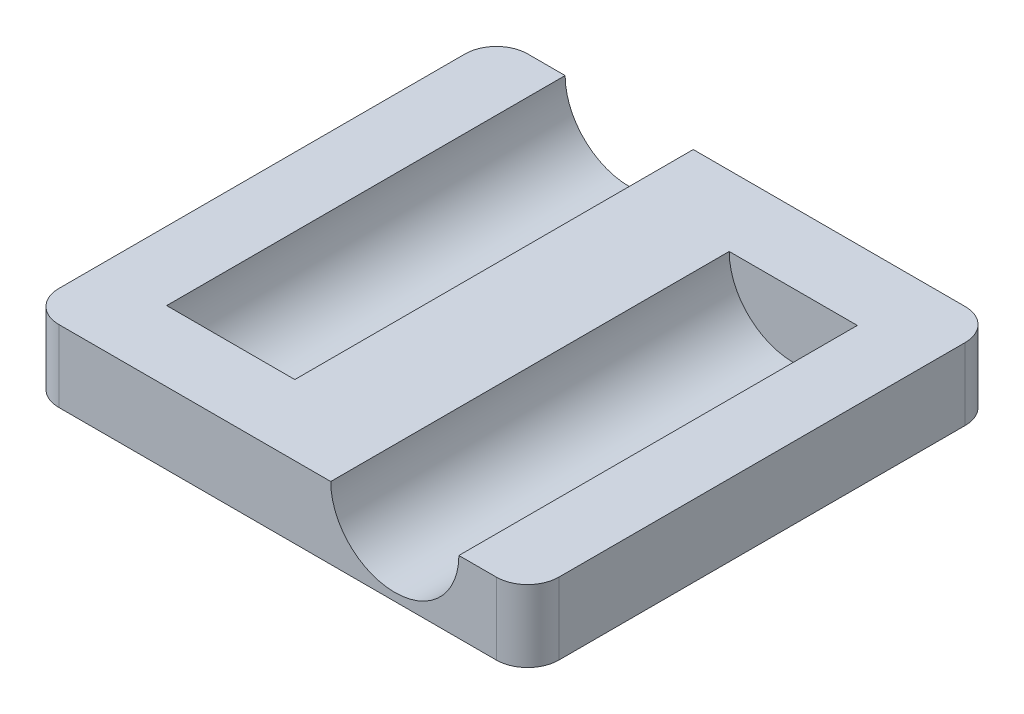
ISO-10303-21;
HEADER;
FILE_DESCRIPTION(('STEP AP214'),'2;1');
FILE_NAME('part.step','',(''),(''),'','','');
FILE_SCHEMA(('AUTOMOTIVE_DESIGN { 1 0 10303 214 1 1 1 1 }'));
ENDSEC;
DATA;
#1=APPLICATION_CONTEXT('core data for automotive mechanical design processes');
#2=APPLICATION_PROTOCOL_DEFINITION('international standard','automotive_design',2000,#1);
#3=PRODUCT_CONTEXT('',#1,'mechanical');
#4=PRODUCT('Part','Part','',(#3));
#5=PRODUCT_RELATED_PRODUCT_CATEGORY('part','',(#4));
#6=PRODUCT_DEFINITION_FORMATION('','',#4);
#7=PRODUCT_DEFINITION_CONTEXT('part definition',#1,'design');
#8=PRODUCT_DEFINITION('design','',#6,#7);
#9=PRODUCT_DEFINITION_SHAPE('','',#8);
#10=(LENGTH_UNIT() NAMED_UNIT(*) SI_UNIT(.MILLI.,.METRE.));
#11=(NAMED_UNIT(*) PLANE_ANGLE_UNIT() SI_UNIT($,.RADIAN.));
#12=(NAMED_UNIT(*) SI_UNIT($,.STERADIAN.) SOLID_ANGLE_UNIT());
#13=UNCERTAINTY_MEASURE_WITH_UNIT(LENGTH_MEASURE(1.E-05),#10,'distance_accuracy_value','');
#14=(GEOMETRIC_REPRESENTATION_CONTEXT(3) GLOBAL_UNCERTAINTY_ASSIGNED_CONTEXT((#13)) GLOBAL_UNIT_ASSIGNED_CONTEXT((#10,
#11,#12)) REPRESENTATION_CONTEXT('',''));
#15=CARTESIAN_POINT('',(0.,0.,0.));
#16=DIRECTION('',(0.,0.,1.));
#17=DIRECTION('',(1.,0.,0.));
#18=AXIS2_PLACEMENT_3D('',#15,#16,#17);
#19=CARTESIAN_POINT('',(-12.0456842552275,-6.59784370077646,30.));
#20=DIRECTION('',(1.,0.,0.));
#21=DIRECTION('',(0.,0.,-1.));
#22=AXIS2_PLACEMENT_3D('',#19,#20,#21);
#23=PLANE('',#22);
#24=DIRECTION('',(0.,-1.,0.));
#25=VECTOR('',#24,1.);
#26=CARTESIAN_POINT('',(-12.0456842552275,-6.59784370077646,2.));
#27=LINE('',#26,#25);
#28=CARTESIAN_POINT('',(-12.0456842552275,-0.197843700776463,2.));
#29=VERTEX_POINT('',#28);
#30=CARTESIAN_POINT('',(-12.0456842552275,-4.79784370077647,2.));
#31=VERTEX_POINT('',#30);
#32=EDGE_CURVE('E188',#29,#31,#27,.T.);
#33=ORIENTED_EDGE('',*,*,#32,.T.);
#34=DIRECTION('',(0.,0.,1.));
#35=VECTOR('',#34,1.);
#36=CARTESIAN_POINT('',(-12.0456842552275,-4.79784370077647,0.));
#37=LINE('',#36,#35);
#38=CARTESIAN_POINT('',(-12.0456842552275,-4.79784370077647,28.));
#39=VERTEX_POINT('',#38);
#40=EDGE_CURVE('E122',#31,#39,#37,.T.);
#41=ORIENTED_EDGE('',*,*,#40,.T.);
#42=DIRECTION('',(0.,-1.,0.));
#43=VECTOR('',#42,1.);
#44=CARTESIAN_POINT('',(-12.0456842552275,-6.59784370077646,28.));
#45=LINE('',#44,#43);
#46=CARTESIAN_POINT('',(-12.0456842552275,-0.197843700776462,28.));
#47=VERTEX_POINT('',#46);
#48=EDGE_CURVE('E149',#39,#47,#45,.F.);
#49=ORIENTED_EDGE('',*,*,#48,.T.);
#50=DIRECTION('',(0.,0.,1.));
#51=VECTOR('',#50,1.);
#52=CARTESIAN_POINT('',(-12.0456842552275,-0.197843700776462,0.));
#53=LINE('',#52,#51);
#54=EDGE_CURVE('E193',#29,#47,#53,.T.);
#55=ORIENTED_EDGE('',*,*,#54,.F.);
#56=EDGE_LOOP('',(#33,#41,#49,#55));
#57=FACE_BOUND('',#56,.T.);
#58=ADVANCED_FACE('F33',(#57),#23,.F.);
#59=CARTESIAN_POINT('',(19.9543157447725,-6.59784370077646,30.));
#60=DIRECTION('',(-1.,0.,0.));
#61=DIRECTION('',(0.,0.,1.));
#62=AXIS2_PLACEMENT_3D('',#59,#60,#61);
#63=PLANE('',#62);
#64=DIRECTION('',(0.,1.,0.));
#65=VECTOR('',#64,1.);
#66=CARTESIAN_POINT('',(19.9543157447725,-6.59784370077646,28.));
#67=LINE('',#66,#65);
#68=CARTESIAN_POINT('',(19.9543157447725,-0.197843700776462,28.));
#69=VERTEX_POINT('',#68);
#70=CARTESIAN_POINT('',(19.9543157447725,-4.79784370077646,28.));
#71=VERTEX_POINT('',#70);
#72=EDGE_CURVE('E185',#69,#71,#67,.F.);
#73=ORIENTED_EDGE('',*,*,#72,.T.);
#74=DIRECTION('',(0.,0.,1.));
#75=VECTOR('',#74,1.);
#76=CARTESIAN_POINT('',(19.9543157447725,-4.79784370077646,0.));
#77=LINE('',#76,#75);
#78=CARTESIAN_POINT('',(19.9543157447725,-4.79784370077646,2.));
#79=VERTEX_POINT('',#78);
#80=EDGE_CURVE('E138',#79,#71,#77,.T.);
#81=ORIENTED_EDGE('',*,*,#80,.F.);
#82=DIRECTION('',(0.,1.,0.));
#83=VECTOR('',#82,1.);
#84=CARTESIAN_POINT('',(19.9543157447725,-0.0978437007764623,2.));
#85=LINE('',#84,#83);
#86=CARTESIAN_POINT('',(19.9543157447725,-0.197843700776463,2.));
#87=VERTEX_POINT('',#86);
#88=EDGE_CURVE('E183',#79,#87,#85,.T.);
#89=ORIENTED_EDGE('',*,*,#88,.T.);
#90=DIRECTION('',(0.,0.,1.));
#91=VECTOR('',#90,1.);
#92=CARTESIAN_POINT('',(19.9543157447725,-0.197843700776462,0.));
#93=LINE('',#92,#91);
#94=EDGE_CURVE('E198',#87,#69,#93,.T.);
#95=ORIENTED_EDGE('',*,*,#94,.T.);
#96=EDGE_LOOP('',(#73,#81,#89,#95));
#97=FACE_BOUND('',#96,.T.);
#98=ADVANCED_FACE('F239',(#97),#63,.F.);
#99=CARTESIAN_POINT('',(0.,0.,30.));
#100=DIRECTION('',(0.,0.,-1.));
#101=DIRECTION('',(-1.,0.,0.));
#102=AXIS2_PLACEMENT_3D('',#99,#100,#101);
#103=PLANE('',#102);
#104=DIRECTION('',(0.,-1.,0.));
#105=VECTOR('',#104,1.);
#106=CARTESIAN_POINT('',(-10.0456842552275,0.,30.));
#107=LINE('',#106,#105);
#108=CARTESIAN_POINT('',(-10.0456842552275,-0.197843700776462,30.));
#109=VERTEX_POINT('',#108);
#110=CARTESIAN_POINT('',(-10.0456842552275,-4.79784370077647,30.));
#111=VERTEX_POINT('',#110);
#112=EDGE_CURVE('E173',#109,#111,#107,.T.);
#113=ORIENTED_EDGE('',*,*,#112,.T.);
#114=DIRECTION('',(-1.,0.,0.));
#115=VECTOR('',#114,1.);
#116=CARTESIAN_POINT('',(19.9543157447725,-4.79784370077646,30.));
#117=LINE('',#116,#115);
#118=CARTESIAN_POINT('',(17.9543157447725,-4.79784370077646,30.));
#119=VERTEX_POINT('',#118);
#120=EDGE_CURVE('E139',#119,#111,#117,.T.);
#121=ORIENTED_EDGE('',*,*,#120,.F.);
#122=DIRECTION('',(0.,1.,0.));
#123=VECTOR('',#122,1.);
#124=CARTESIAN_POINT('',(17.9543157447725,0.,30.));
#125=LINE('',#124,#123);
#126=CARTESIAN_POINT('',(17.9543157447725,-0.197843700776462,30.));
#127=VERTEX_POINT('',#126);
#128=EDGE_CURVE('E181',#119,#127,#125,.T.);
#129=ORIENTED_EDGE('',*,*,#128,.T.);
#130=DIRECTION('',(1.,0.,0.));
#131=VECTOR('',#130,1.);
#132=CARTESIAN_POINT('',(-12.0456842552275,-0.197843700776462,30.));
#133=LINE('',#132,#131);
#134=CARTESIAN_POINT('',(15.5543157447725,-0.197843700776462,30.));
#135=VERTEX_POINT('',#134);
#136=EDGE_CURVE('E218',#135,#127,#133,.T.);
#137=ORIENTED_EDGE('',*,*,#136,.F.);
#138=CARTESIAN_POINT('',(11.4543157447725,-0.197843700776464,30.));
#139=DIRECTION('',(0.,0.,-1.));
#140=DIRECTION('',(-1.,0.,0.));
#141=AXIS2_PLACEMENT_3D('',#138,#139,#140);
#142=CIRCLE('',#141,4.1);
#143=CARTESIAN_POINT('',(7.35431574477247,-0.197843700776462,30.));
#144=VERTEX_POINT('',#143);
#145=EDGE_CURVE('E147',#135,#144,#142,.T.);
#146=ORIENTED_EDGE('',*,*,#145,.T.);
#147=EDGE_CURVE('E55',#109,#144,#133,.T.);
#148=ORIENTED_EDGE('',*,*,#147,.F.);
#149=EDGE_LOOP('',(#113,#121,#129,#137,#146,#148));
#150=FACE_BOUND('',#149,.T.);
#151=ADVANCED_FACE('F231',(#150),#103,.F.);
#152=CARTESIAN_POINT('',(0.,0.,0.));
#153=DIRECTION('',(0.,0.,-1.));
#154=DIRECTION('',(-1.,0.,0.));
#155=AXIS2_PLACEMENT_3D('',#152,#153,#154);
#156=PLANE('',#155);
#157=DIRECTION('',(-1.,0.,0.));
#158=VECTOR('',#157,1.);
#159=CARTESIAN_POINT('',(19.9543157447725,-4.79784370077646,0.));
#160=LINE('',#159,#158);
#161=CARTESIAN_POINT('',(17.9543157447725,-4.79784370077646,0.));
#162=VERTEX_POINT('',#161);
#163=CARTESIAN_POINT('',(-10.0456842552275,-4.79784370077647,0.));
#164=VERTEX_POINT('',#163);
#165=EDGE_CURVE('E47',#162,#164,#160,.T.);
#166=ORIENTED_EDGE('',*,*,#165,.T.);
#167=DIRECTION('',(0.,-1.,0.));
#168=VECTOR('',#167,1.);
#169=CARTESIAN_POINT('',(-10.0456842552275,-0.0978437007764623,0.));
#170=LINE('',#169,#168);
#171=CARTESIAN_POINT('',(-10.0456842552275,-0.197843700776462,0.));
#172=VERTEX_POINT('',#171);
#173=EDGE_CURVE('E133',#164,#172,#170,.F.);
#174=ORIENTED_EDGE('',*,*,#173,.T.);
#175=DIRECTION('',(1.,0.,0.));
#176=VECTOR('',#175,1.);
#177=CARTESIAN_POINT('',(-12.0456842552275,-0.197843700776462,0.));
#178=LINE('',#177,#176);
#179=CARTESIAN_POINT('',(-7.64568425522754,-0.197843700776462,0.));
#180=VERTEX_POINT('',#179);
#181=EDGE_CURVE('E199',#172,#180,#178,.T.);
#182=ORIENTED_EDGE('',*,*,#181,.T.);
#183=CARTESIAN_POINT('',(-3.54568425522754,-0.197843700776464,0.));
#184=DIRECTION('',(0.,0.,-1.));
#185=DIRECTION('',(-1.,0.,0.));
#186=AXIS2_PLACEMENT_3D('',#183,#184,#185);
#187=CIRCLE('',#186,4.1);
#188=CARTESIAN_POINT('',(0.554315744772464,-0.197843700776462,0.));
#189=VERTEX_POINT('',#188);
#190=EDGE_CURVE('E144',#189,#180,#187,.T.);
#191=ORIENTED_EDGE('',*,*,#190,.F.);
#192=CARTESIAN_POINT('',(17.9543157447725,-0.197843700776462,0.));
#193=VERTEX_POINT('',#192);
#194=EDGE_CURVE('E221',#189,#193,#178,.T.);
#195=ORIENTED_EDGE('',*,*,#194,.T.);
#196=DIRECTION('',(0.,1.,0.));
#197=VECTOR('',#196,1.);
#198=CARTESIAN_POINT('',(17.9543157447725,-6.59784370077646,0.));
#199=LINE('',#198,#197);
#200=EDGE_CURVE('E137',#193,#162,#199,.F.);
#201=ORIENTED_EDGE('',*,*,#200,.T.);
#202=EDGE_LOOP('',(#166,#174,#182,#191,#195,#201));
#203=FACE_BOUND('',#202,.T.);
#204=ADVANCED_FACE('F131',(#203),#156,.T.);
#205=CARTESIAN_POINT('',(17.9543157447725,0.,28.));
#206=DIRECTION('',(0.,1.,0.));
#207=DIRECTION('',(0.,0.,1.));
#208=AXIS2_PLACEMENT_3D('',#205,#206,#207);
#209=CYLINDRICAL_SURFACE('',#208,2.);
#210=CARTESIAN_POINT('',(17.9543157447725,-4.79784370077646,28.));
#211=DIRECTION('',(0.,1.,0.));
#212=DIRECTION('',(-1.,0.,0.));
#213=AXIS2_PLACEMENT_3D('',#210,#211,#212);
#214=CIRCLE('',#213,2.);
#215=EDGE_CURVE('E220',#71,#119,#214,.F.);
#216=ORIENTED_EDGE('',*,*,#215,.F.);
#217=ORIENTED_EDGE('',*,*,#72,.F.);
#218=CARTESIAN_POINT('',(17.9543157447725,-0.197843700776462,28.));
#219=DIRECTION('',(0.,-1.,0.));
#220=DIRECTION('',(0.,0.,-1.));
#221=AXIS2_PLACEMENT_3D('',#218,#219,#220);
#222=CIRCLE('',#221,2.);
#223=EDGE_CURVE('E170',#127,#69,#222,.F.);
#224=ORIENTED_EDGE('',*,*,#223,.F.);
#225=ORIENTED_EDGE('',*,*,#128,.F.);
#226=EDGE_LOOP('',(#216,#217,#224,#225));
#227=FACE_BOUND('',#226,.T.);
#228=ADVANCED_FACE('F236',(#227),#209,.T.);
#229=CARTESIAN_POINT('',(-10.0456842552275,0.,28.));
#230=DIRECTION('',(0.,-1.,0.));
#231=DIRECTION('',(0.,0.,-1.));
#232=AXIS2_PLACEMENT_3D('',#229,#230,#231);
#233=CYLINDRICAL_SURFACE('',#232,2.);
#234=CARTESIAN_POINT('',(-10.0456842552275,-4.79784370077647,28.));
#235=DIRECTION('',(0.,1.,0.));
#236=DIRECTION('',(-1.,0.,0.));
#237=AXIS2_PLACEMENT_3D('',#234,#235,#236);
#238=CIRCLE('',#237,2.);
#239=EDGE_CURVE('E127',#111,#39,#238,.F.);
#240=ORIENTED_EDGE('',*,*,#239,.F.);
#241=ORIENTED_EDGE('',*,*,#112,.F.);
#242=CARTESIAN_POINT('',(-10.0456842552275,-0.197843700776462,28.));
#243=DIRECTION('',(0.,-1.,0.));
#244=DIRECTION('',(0.,0.,-1.));
#245=AXIS2_PLACEMENT_3D('',#242,#243,#244);
#246=CIRCLE('',#245,2.);
#247=EDGE_CURVE('E175',#47,#109,#246,.F.);
#248=ORIENTED_EDGE('',*,*,#247,.F.);
#249=ORIENTED_EDGE('',*,*,#48,.F.);
#250=EDGE_LOOP('',(#240,#241,#248,#249));
#251=FACE_BOUND('',#250,.T.);
#252=ADVANCED_FACE('F202',(#251),#233,.T.);
#253=CARTESIAN_POINT('',(-10.0456842552275,-6.59784370077646,2.));
#254=DIRECTION('',(0.,1.,0.));
#255=DIRECTION('',(0.,0.,1.));
#256=AXIS2_PLACEMENT_3D('',#253,#254,#255);
#257=CYLINDRICAL_SURFACE('',#256,2.);
#258=CARTESIAN_POINT('',(-10.0456842552275,-4.79784370077647,2.));
#259=DIRECTION('',(0.,1.,0.));
#260=DIRECTION('',(-1.,0.,0.));
#261=AXIS2_PLACEMENT_3D('',#258,#259,#260);
#262=CIRCLE('',#261,2.);
#263=EDGE_CURVE('E119',#31,#164,#262,.F.);
#264=ORIENTED_EDGE('',*,*,#263,.F.);
#265=ORIENTED_EDGE('',*,*,#32,.F.);
#266=CARTESIAN_POINT('',(-10.0456842552275,-0.197843700776463,2.));
#267=DIRECTION('',(0.,-1.,0.));
#268=DIRECTION('',(0.,0.,-1.));
#269=AXIS2_PLACEMENT_3D('',#266,#267,#268);
#270=CIRCLE('',#269,2.);
#271=EDGE_CURVE('E143',#172,#29,#270,.F.);
#272=ORIENTED_EDGE('',*,*,#271,.F.);
#273=ORIENTED_EDGE('',*,*,#173,.F.);
#274=EDGE_LOOP('',(#264,#265,#272,#273));
#275=FACE_BOUND('',#274,.T.);
#276=ADVANCED_FACE('F142',(#275),#257,.T.);
#277=CARTESIAN_POINT('',(17.9543157447725,-6.59784370077646,2.));
#278=DIRECTION('',(0.,-1.,0.));
#279=DIRECTION('',(0.,0.,-1.));
#280=AXIS2_PLACEMENT_3D('',#277,#278,#279);
#281=CYLINDRICAL_SURFACE('',#280,2.);
#282=CARTESIAN_POINT('',(17.9543157447725,-4.79784370077646,2.));
#283=DIRECTION('',(0.,1.,0.));
#284=DIRECTION('',(-1.,0.,0.));
#285=AXIS2_PLACEMENT_3D('',#282,#283,#284);
#286=CIRCLE('',#285,2.);
#287=EDGE_CURVE('E11',#162,#79,#286,.F.);
#288=ORIENTED_EDGE('',*,*,#287,.F.);
#289=ORIENTED_EDGE('',*,*,#200,.F.);
#290=CARTESIAN_POINT('',(17.9543157447725,-0.197843700776463,2.));
#291=DIRECTION('',(0.,-1.,0.));
#292=DIRECTION('',(0.,0.,-1.));
#293=AXIS2_PLACEMENT_3D('',#290,#291,#292);
#294=CIRCLE('',#293,2.);
#295=EDGE_CURVE('E203',#87,#193,#294,.F.);
#296=ORIENTED_EDGE('',*,*,#295,.F.);
#297=ORIENTED_EDGE('',*,*,#88,.F.);
#298=EDGE_LOOP('',(#288,#289,#296,#297));
#299=FACE_BOUND('',#298,.T.);
#300=ADVANCED_FACE('F35',(#299),#281,.T.);
#301=CARTESIAN_POINT('',(-3.54568425522754,-0.197843700776464,25.5));
#302=DIRECTION('',(0.,0.,-1.));
#303=DIRECTION('',(-1.,0.,0.));
#304=AXIS2_PLACEMENT_3D('',#301,#302,#303);
#305=PLANE('',#304);
#306=DIRECTION('',(-1.,0.,0.));
#307=VECTOR('',#306,1.);
#308=CARTESIAN_POINT('',(-3.54568425522754,-0.197843700776464,25.5));
#309=LINE('',#308,#307);
#310=CARTESIAN_POINT('',(0.554315744772464,-0.197843700776462,25.5));
#311=VERTEX_POINT('',#310);
#312=CARTESIAN_POINT('',(-7.64568425522754,-0.197843700776464,25.5));
#313=VERTEX_POINT('',#312);
#314=EDGE_CURVE('E210',#311,#313,#309,.T.);
#315=ORIENTED_EDGE('',*,*,#314,.F.);
#316=CARTESIAN_POINT('',(-3.54568425522754,-0.197843700776464,25.5));
#317=DIRECTION('',(0.,0.,-1.));
#318=DIRECTION('',(-1.,0.,0.));
#319=AXIS2_PLACEMENT_3D('',#316,#317,#318);
#320=CIRCLE('',#319,4.1);
#321=EDGE_CURVE('E169',#311,#313,#320,.T.);
#322=ORIENTED_EDGE('',*,*,#321,.T.);
#323=EDGE_LOOP('',(#315,#322));
#324=FACE_BOUND('',#323,.T.);
#325=ADVANCED_FACE('F244',(#324),#305,.T.);
#326=CARTESIAN_POINT('',(-3.54568425522754,-0.197843700776464,25.5));
#327=DIRECTION('',(0.,0.,-1.));
#328=DIRECTION('',(-1.,0.,0.));
#329=AXIS2_PLACEMENT_3D('',#326,#327,#328);
#330=CYLINDRICAL_SURFACE('',#329,4.1);
#331=ORIENTED_EDGE('',*,*,#190,.T.);
#332=DIRECTION('',(0.,0.,-1.));
#333=VECTOR('',#332,1.);
#334=CARTESIAN_POINT('',(-7.64568425522754,-0.197843700776462,25.5));
#335=LINE('',#334,#333);
#336=EDGE_CURVE('E207',#180,#313,#335,.F.);
#337=ORIENTED_EDGE('',*,*,#336,.T.);
#338=ORIENTED_EDGE('',*,*,#321,.F.);
#339=DIRECTION('',(0.,0.,-1.));
#340=VECTOR('',#339,1.);
#341=CARTESIAN_POINT('',(0.554315744772464,-0.197843700776462,25.5));
#342=LINE('',#341,#340);
#343=EDGE_CURVE('E212',#311,#189,#342,.T.);
#344=ORIENTED_EDGE('',*,*,#343,.T.);
#345=EDGE_LOOP('',(#331,#337,#338,#344));
#346=FACE_BOUND('',#345,.T.);
#347=ADVANCED_FACE('F250',(#346),#330,.F.);
#348=CARTESIAN_POINT('',(11.4543157447725,-0.197843700776464,4.5));
#349=DIRECTION('',(0.,0.,1.));
#350=DIRECTION('',(1.,0.,0.));
#351=AXIS2_PLACEMENT_3D('',#348,#349,#350);
#352=PLANE('',#351);
#353=DIRECTION('',(1.,0.,0.));
#354=VECTOR('',#353,1.);
#355=CARTESIAN_POINT('',(11.4543157447725,-0.197843700776464,4.5));
#356=LINE('',#355,#354);
#357=CARTESIAN_POINT('',(7.35431574477247,-0.197843700776462,4.5));
#358=VERTEX_POINT('',#357);
#359=CARTESIAN_POINT('',(15.5543157447725,-0.197843700776464,4.5));
#360=VERTEX_POINT('',#359);
#361=EDGE_CURVE('E168',#358,#360,#356,.T.);
#362=ORIENTED_EDGE('',*,*,#361,.F.);
#363=CARTESIAN_POINT('',(11.4543157447725,-0.197843700776464,4.5));
#364=DIRECTION('',(0.,0.,1.));
#365=DIRECTION('',(1.,0.,0.));
#366=AXIS2_PLACEMENT_3D('',#363,#364,#365);
#367=CIRCLE('',#366,4.1);
#368=EDGE_CURVE('E162',#358,#360,#367,.T.);
#369=ORIENTED_EDGE('',*,*,#368,.T.);
#370=EDGE_LOOP('',(#362,#369));
#371=FACE_BOUND('',#370,.T.);
#372=ADVANCED_FACE('F167',(#371),#352,.T.);
#373=CARTESIAN_POINT('',(11.4543157447725,-0.197843700776464,4.5));
#374=DIRECTION('',(0.,0.,1.));
#375=DIRECTION('',(1.,0.,0.));
#376=AXIS2_PLACEMENT_3D('',#373,#374,#375);
#377=CYLINDRICAL_SURFACE('',#376,4.1);
#378=ORIENTED_EDGE('',*,*,#145,.F.);
#379=DIRECTION('',(0.,0.,1.));
#380=VECTOR('',#379,1.);
#381=CARTESIAN_POINT('',(15.5543157447725,-0.197843700776462,4.5));
#382=LINE('',#381,#380);
#383=EDGE_CURVE('E41',#135,#360,#382,.F.);
#384=ORIENTED_EDGE('',*,*,#383,.T.);
#385=ORIENTED_EDGE('',*,*,#368,.F.);
#386=DIRECTION('',(0.,0.,1.));
#387=VECTOR('',#386,1.);
#388=CARTESIAN_POINT('',(7.35431574477247,-0.197843700776462,4.5));
#389=LINE('',#388,#387);
#390=EDGE_CURVE('E155',#358,#144,#389,.T.);
#391=ORIENTED_EDGE('',*,*,#390,.T.);
#392=EDGE_LOOP('',(#378,#384,#385,#391));
#393=FACE_BOUND('',#392,.T.);
#394=ADVANCED_FACE('F161',(#393),#377,.F.);
#395=CARTESIAN_POINT('',(-12.0456842552275,-0.197843700776462,0.));
#396=DIRECTION('',(0.,-1.,0.));
#397=DIRECTION('',(0.,0.,-1.));
#398=AXIS2_PLACEMENT_3D('',#395,#396,#397);
#399=PLANE('',#398);
#400=ORIENTED_EDGE('',*,*,#223,.T.);
#401=ORIENTED_EDGE('',*,*,#94,.F.);
#402=ORIENTED_EDGE('',*,*,#295,.T.);
#403=ORIENTED_EDGE('',*,*,#194,.F.);
#404=ORIENTED_EDGE('',*,*,#343,.F.);
#405=ORIENTED_EDGE('',*,*,#314,.T.);
#406=ORIENTED_EDGE('',*,*,#336,.F.);
#407=ORIENTED_EDGE('',*,*,#181,.F.);
#408=ORIENTED_EDGE('',*,*,#271,.T.);
#409=ORIENTED_EDGE('',*,*,#54,.T.);
#410=ORIENTED_EDGE('',*,*,#247,.T.);
#411=ORIENTED_EDGE('',*,*,#147,.T.);
#412=ORIENTED_EDGE('',*,*,#390,.F.);
#413=ORIENTED_EDGE('',*,*,#361,.T.);
#414=ORIENTED_EDGE('',*,*,#383,.F.);
#415=ORIENTED_EDGE('',*,*,#136,.T.);
#416=EDGE_LOOP('',(#400,#401,#402,#403,#404,#405,#406,#407,#408,#409,#410,#411,#412,#413,#414,#415));
#417=FACE_BOUND('',#416,.T.);
#418=ADVANCED_FACE('F197',(#417),#399,.F.);
#419=CARTESIAN_POINT('',(19.9543157447725,-4.79784370077646,0.));
#420=DIRECTION('',(0.,1.,0.));
#421=DIRECTION('',(-1.,0.,0.));
#422=AXIS2_PLACEMENT_3D('',#419,#420,#421);
#423=PLANE('',#422);
#424=ORIENTED_EDGE('',*,*,#215,.T.);
#425=ORIENTED_EDGE('',*,*,#120,.T.);
#426=ORIENTED_EDGE('',*,*,#239,.T.);
#427=ORIENTED_EDGE('',*,*,#40,.F.);
#428=ORIENTED_EDGE('',*,*,#263,.T.);
#429=ORIENTED_EDGE('',*,*,#165,.F.);
#430=ORIENTED_EDGE('',*,*,#287,.T.);
#431=ORIENTED_EDGE('',*,*,#80,.T.);
#432=EDGE_LOOP('',(#424,#425,#426,#427,#428,#429,#430,#431));
#433=FACE_BOUND('',#432,.T.);
#434=ADVANCED_FACE('F120',(#433),#423,.F.);
#435=CLOSED_SHELL('',(#58,#98,#151,#204,#228,#252,#276,#300,#325,#347,#372,#394,#418,#434));
#436=MANIFOLD_SOLID_BREP('B2',#435);
#437=ADVANCED_BREP_SHAPE_REPRESENTATION('',(#18,#436),#14);
#438=SHAPE_DEFINITION_REPRESENTATION(#9,#437);
ENDSEC;
END-ISO-10303-21;
